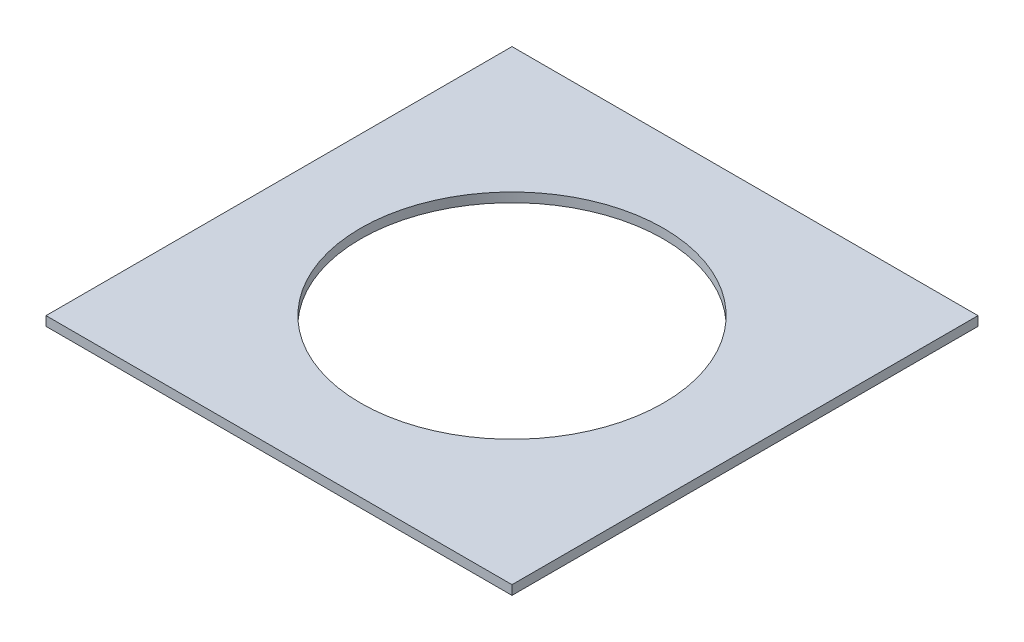
ISO-10303-21;
HEADER;
FILE_DESCRIPTION(('STEP AP214'),'2;1');
FILE_NAME('part.step','',(''),(''),'','','');
FILE_SCHEMA(('AUTOMOTIVE_DESIGN { 1 0 10303 214 1 1 1 1 }'));
ENDSEC;
DATA;
#1=APPLICATION_CONTEXT('core data for automotive mechanical design processes');
#2=APPLICATION_PROTOCOL_DEFINITION('international standard','automotive_design',2000,#1);
#3=PRODUCT_CONTEXT('',#1,'mechanical');
#4=PRODUCT('Part','Part','',(#3));
#5=PRODUCT_RELATED_PRODUCT_CATEGORY('part','',(#4));
#6=PRODUCT_DEFINITION_FORMATION('','',#4);
#7=PRODUCT_DEFINITION_CONTEXT('part definition',#1,'design');
#8=PRODUCT_DEFINITION('design','',#6,#7);
#9=PRODUCT_DEFINITION_SHAPE('','',#8);
#10=(LENGTH_UNIT() NAMED_UNIT(*) SI_UNIT(.MILLI.,.METRE.));
#11=(NAMED_UNIT(*) PLANE_ANGLE_UNIT() SI_UNIT($,.RADIAN.));
#12=(NAMED_UNIT(*) SI_UNIT($,.STERADIAN.) SOLID_ANGLE_UNIT());
#13=UNCERTAINTY_MEASURE_WITH_UNIT(LENGTH_MEASURE(1.E-05),#10,'distance_accuracy_value','');
#14=(GEOMETRIC_REPRESENTATION_CONTEXT(3) GLOBAL_UNCERTAINTY_ASSIGNED_CONTEXT((#13)) GLOBAL_UNIT_ASSIGNED_CONTEXT((#10,
#11,#12)) REPRESENTATION_CONTEXT('',''));
#15=CARTESIAN_POINT('',(0.,0.,0.));
#16=DIRECTION('',(0.,0.,1.));
#17=DIRECTION('',(1.,0.,0.));
#18=AXIS2_PLACEMENT_3D('',#15,#16,#17);
#19=CARTESIAN_POINT('',(0.,5.,0.));
#20=DIRECTION('',(0.,1.,0.));
#21=DIRECTION('',(0.,0.,1.));
#22=AXIS2_PLACEMENT_3D('',#19,#20,#21);
#23=PLANE('',#22);
#24=DIRECTION('',(0.,0.,-1.));
#25=VECTOR('',#24,1.);
#26=CARTESIAN_POINT('',(250.,5.,-250.));
#27=LINE('',#26,#25);
#28=CARTESIAN_POINT('',(250.,5.,250.));
#29=VERTEX_POINT('',#28);
#30=CARTESIAN_POINT('',(250.,5.,-250.));
#31=VERTEX_POINT('',#30);
#32=EDGE_CURVE('E94',#29,#31,#27,.T.);
#33=ORIENTED_EDGE('',*,*,#32,.T.);
#34=DIRECTION('',(-1.,0.,0.));
#35=VECTOR('',#34,1.);
#36=CARTESIAN_POINT('',(-250.,5.,-250.));
#37=LINE('',#36,#35);
#38=CARTESIAN_POINT('',(-250.,5.,-250.));
#39=VERTEX_POINT('',#38);
#40=EDGE_CURVE('E89',#31,#39,#37,.T.);
#41=ORIENTED_EDGE('',*,*,#40,.T.);
#42=DIRECTION('',(0.,0.,1.));
#43=VECTOR('',#42,1.);
#44=CARTESIAN_POINT('',(-250.,5.,-250.));
#45=LINE('',#44,#43);
#46=CARTESIAN_POINT('',(-250.,5.,250.));
#47=VERTEX_POINT('',#46);
#48=EDGE_CURVE('E92',#39,#47,#45,.T.);
#49=ORIENTED_EDGE('',*,*,#48,.T.);
#50=DIRECTION('',(1.,0.,0.));
#51=VECTOR('',#50,1.);
#52=CARTESIAN_POINT('',(-250.,5.,250.));
#53=LINE('',#52,#51);
#54=EDGE_CURVE('E59',#47,#29,#53,.T.);
#55=ORIENTED_EDGE('',*,*,#54,.T.);
#56=EDGE_LOOP('',(#33,#41,#49,#55));
#57=FACE_BOUND('',#56,.T.);
#58=CARTESIAN_POINT('',(0.,5.,0.));
#59=DIRECTION('',(0.,1.,0.));
#60=DIRECTION('',(0.,0.,1.));
#61=AXIS2_PLACEMENT_3D('',#58,#59,#60);
#62=CIRCLE('',#61,162.5);
#63=CARTESIAN_POINT('',(0.,5.,162.5));
#64=VERTEX_POINT('',#63);
#65=EDGE_CURVE('E116',#64,#64,#62,.T.);
#66=ORIENTED_EDGE('',*,*,#65,.F.);
#67=EDGE_LOOP('',(#66));
#68=FACE_BOUND('',#67,.T.);
#69=ADVANCED_FACE('F41',(#57,#68),#23,.T.);
#70=CARTESIAN_POINT('',(0.,-5.,0.));
#71=DIRECTION('',(0.,1.,0.));
#72=DIRECTION('',(0.,0.,1.));
#73=AXIS2_PLACEMENT_3D('',#70,#71,#72);
#74=PLANE('',#73);
#75=DIRECTION('',(0.,0.,-1.));
#76=VECTOR('',#75,1.);
#77=CARTESIAN_POINT('',(250.,-5.,-250.));
#78=LINE('',#77,#76);
#79=CARTESIAN_POINT('',(250.,-5.,250.));
#80=VERTEX_POINT('',#79);
#81=CARTESIAN_POINT('',(250.,-5.,-250.));
#82=VERTEX_POINT('',#81);
#83=EDGE_CURVE('E112',#80,#82,#78,.T.);
#84=ORIENTED_EDGE('',*,*,#83,.F.);
#85=DIRECTION('',(1.,0.,0.));
#86=VECTOR('',#85,1.);
#87=CARTESIAN_POINT('',(-250.,-5.,250.));
#88=LINE('',#87,#86);
#89=CARTESIAN_POINT('',(-250.,-5.,250.));
#90=VERTEX_POINT('',#89);
#91=EDGE_CURVE('E82',#90,#80,#88,.T.);
#92=ORIENTED_EDGE('',*,*,#91,.F.);
#93=DIRECTION('',(0.,0.,1.));
#94=VECTOR('',#93,1.);
#95=CARTESIAN_POINT('',(-250.,-5.,-250.));
#96=LINE('',#95,#94);
#97=CARTESIAN_POINT('',(-250.,-5.,-250.));
#98=VERTEX_POINT('',#97);
#99=EDGE_CURVE('E76',#98,#90,#96,.T.);
#100=ORIENTED_EDGE('',*,*,#99,.F.);
#101=DIRECTION('',(-1.,0.,0.));
#102=VECTOR('',#101,1.);
#103=CARTESIAN_POINT('',(-250.,-5.,-250.));
#104=LINE('',#103,#102);
#105=EDGE_CURVE('E99',#82,#98,#104,.T.);
#106=ORIENTED_EDGE('',*,*,#105,.F.);
#107=EDGE_LOOP('',(#84,#92,#100,#106));
#108=FACE_BOUND('',#107,.T.);
#109=CARTESIAN_POINT('',(0.,-5.,0.));
#110=DIRECTION('',(0.,1.,0.));
#111=DIRECTION('',(0.,0.,1.));
#112=AXIS2_PLACEMENT_3D('',#109,#110,#111);
#113=CIRCLE('',#112,162.5);
#114=CARTESIAN_POINT('',(0.,-5.,162.5));
#115=VERTEX_POINT('',#114);
#116=EDGE_CURVE('E138',#115,#115,#113,.T.);
#117=ORIENTED_EDGE('',*,*,#116,.T.);
#118=EDGE_LOOP('',(#117));
#119=FACE_BOUND('',#118,.T.);
#120=ADVANCED_FACE('F131',(#108,#119),#74,.F.);
#121=CARTESIAN_POINT('',(250.,5.,-250.));
#122=DIRECTION('',(-1.,0.,0.));
#123=DIRECTION('',(0.,0.,1.));
#124=AXIS2_PLACEMENT_3D('',#121,#122,#123);
#125=PLANE('',#124);
#126=ORIENTED_EDGE('',*,*,#83,.T.);
#127=DIRECTION('',(0.,-1.,0.));
#128=VECTOR('',#127,1.);
#129=CARTESIAN_POINT('',(250.,5.,-250.));
#130=LINE('',#129,#128);
#131=EDGE_CURVE('E11',#31,#82,#130,.T.);
#132=ORIENTED_EDGE('',*,*,#131,.F.);
#133=ORIENTED_EDGE('',*,*,#32,.F.);
#134=DIRECTION('',(0.,-1.,0.));
#135=VECTOR('',#134,1.);
#136=CARTESIAN_POINT('',(250.,5.,250.));
#137=LINE('',#136,#135);
#138=EDGE_CURVE('E108',#29,#80,#137,.T.);
#139=ORIENTED_EDGE('',*,*,#138,.T.);
#140=EDGE_LOOP('',(#126,#132,#133,#139));
#141=FACE_BOUND('',#140,.T.);
#142=ADVANCED_FACE('F43',(#141),#125,.F.);
#143=CARTESIAN_POINT('',(-250.,5.,-250.));
#144=DIRECTION('',(0.,0.,1.));
#145=DIRECTION('',(1.,0.,0.));
#146=AXIS2_PLACEMENT_3D('',#143,#144,#145);
#147=PLANE('',#146);
#148=ORIENTED_EDGE('',*,*,#105,.T.);
#149=DIRECTION('',(0.,-1.,0.));
#150=VECTOR('',#149,1.);
#151=CARTESIAN_POINT('',(-250.,5.,-250.));
#152=LINE('',#151,#150);
#153=EDGE_CURVE('E51',#39,#98,#152,.T.);
#154=ORIENTED_EDGE('',*,*,#153,.F.);
#155=ORIENTED_EDGE('',*,*,#40,.F.);
#156=ORIENTED_EDGE('',*,*,#131,.T.);
#157=EDGE_LOOP('',(#148,#154,#155,#156));
#158=FACE_BOUND('',#157,.T.);
#159=ADVANCED_FACE('F98',(#158),#147,.F.);
#160=CARTESIAN_POINT('',(-250.,5.,-250.));
#161=DIRECTION('',(1.,0.,0.));
#162=DIRECTION('',(0.,0.,-1.));
#163=AXIS2_PLACEMENT_3D('',#160,#161,#162);
#164=PLANE('',#163);
#165=ORIENTED_EDGE('',*,*,#99,.T.);
#166=DIRECTION('',(0.,-1.,0.));
#167=VECTOR('',#166,1.);
#168=CARTESIAN_POINT('',(-250.,5.,250.));
#169=LINE('',#168,#167);
#170=EDGE_CURVE('E101',#47,#90,#169,.T.);
#171=ORIENTED_EDGE('',*,*,#170,.F.);
#172=ORIENTED_EDGE('',*,*,#48,.F.);
#173=ORIENTED_EDGE('',*,*,#153,.T.);
#174=EDGE_LOOP('',(#165,#171,#172,#173));
#175=FACE_BOUND('',#174,.T.);
#176=ADVANCED_FACE('F102',(#175),#164,.F.);
#177=CARTESIAN_POINT('',(-250.,5.,250.));
#178=DIRECTION('',(0.,0.,-1.));
#179=DIRECTION('',(-1.,0.,0.));
#180=AXIS2_PLACEMENT_3D('',#177,#178,#179);
#181=PLANE('',#180);
#182=ORIENTED_EDGE('',*,*,#91,.T.);
#183=ORIENTED_EDGE('',*,*,#138,.F.);
#184=ORIENTED_EDGE('',*,*,#54,.F.);
#185=ORIENTED_EDGE('',*,*,#170,.T.);
#186=EDGE_LOOP('',(#182,#183,#184,#185));
#187=FACE_BOUND('',#186,.T.);
#188=ADVANCED_FACE('F128',(#187),#181,.F.);
#189=CARTESIAN_POINT('',(0.,5.,0.));
#190=DIRECTION('',(0.,-1.,0.));
#191=DIRECTION('',(0.,0.,-1.));
#192=AXIS2_PLACEMENT_3D('',#189,#190,#191);
#193=CYLINDRICAL_SURFACE('',#192,162.5);
#194=ORIENTED_EDGE('',*,*,#65,.T.);
#195=EDGE_LOOP('',(#194));
#196=FACE_BOUND('',#195,.T.);
#197=ORIENTED_EDGE('',*,*,#116,.F.);
#198=EDGE_LOOP('',(#197));
#199=FACE_BOUND('',#198,.T.);
#200=ADVANCED_FACE('F148',(#196,#199),#193,.F.);
#201=CLOSED_SHELL('',(#69,#120,#142,#159,#176,#188,#200));
#202=MANIFOLD_SOLID_BREP('B2',#201);
#203=ADVANCED_BREP_SHAPE_REPRESENTATION('',(#18,#202),#14);
#204=SHAPE_DEFINITION_REPRESENTATION(#9,#203);
ENDSEC;
END-ISO-10303-21;
